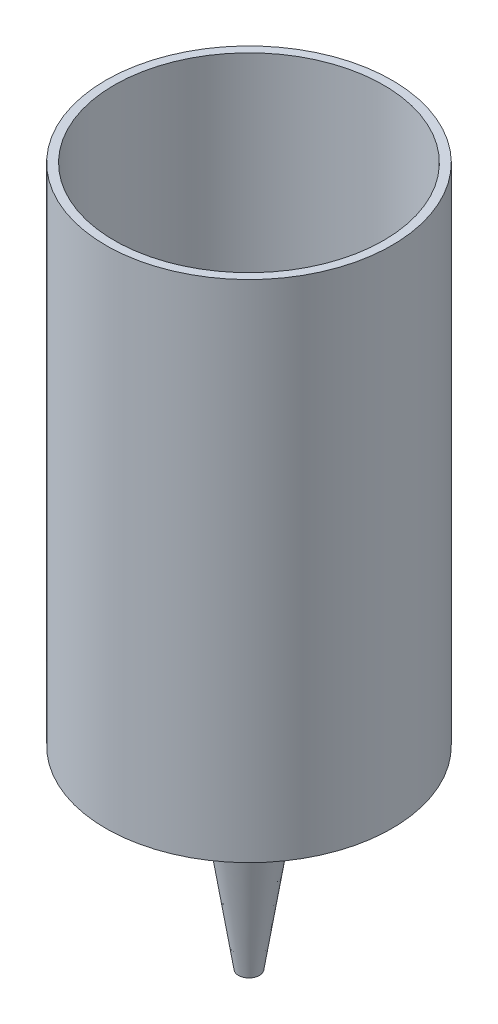
ISO-10303-21;
HEADER;
FILE_DESCRIPTION(('STEP AP214'),'2;1');
FILE_NAME('part.step','',(''),(''),'','','');
FILE_SCHEMA(('AUTOMOTIVE_DESIGN { 1 0 10303 214 1 1 1 1 }'));
ENDSEC;
DATA;
#1=APPLICATION_CONTEXT('core data for automotive mechanical design processes');
#2=APPLICATION_PROTOCOL_DEFINITION('international standard','automotive_design',2000,#1);
#3=PRODUCT_CONTEXT('',#1,'mechanical');
#4=PRODUCT('Part','Part','',(#3));
#5=PRODUCT_RELATED_PRODUCT_CATEGORY('part','',(#4));
#6=PRODUCT_DEFINITION_FORMATION('','',#4);
#7=PRODUCT_DEFINITION_CONTEXT('part definition',#1,'design');
#8=PRODUCT_DEFINITION('design','',#6,#7);
#9=PRODUCT_DEFINITION_SHAPE('','',#8);
#10=(LENGTH_UNIT() NAMED_UNIT(*) SI_UNIT(.MILLI.,.METRE.));
#11=(NAMED_UNIT(*) PLANE_ANGLE_UNIT() SI_UNIT($,.RADIAN.));
#12=(NAMED_UNIT(*) SI_UNIT($,.STERADIAN.) SOLID_ANGLE_UNIT());
#13=UNCERTAINTY_MEASURE_WITH_UNIT(LENGTH_MEASURE(1.E-05),#10,'distance_accuracy_value','');
#14=(GEOMETRIC_REPRESENTATION_CONTEXT(3) GLOBAL_UNCERTAINTY_ASSIGNED_CONTEXT((#13)) GLOBAL_UNIT_ASSIGNED_CONTEXT((#10,
#11,#12)) REPRESENTATION_CONTEXT('',''));
#15=CARTESIAN_POINT('',(0.,0.,0.));
#16=DIRECTION('',(0.,0.,1.));
#17=DIRECTION('',(1.,0.,0.));
#18=AXIS2_PLACEMENT_3D('',#15,#16,#17);
#19=CARTESIAN_POINT('',(0.,29.21,0.));
#20=DIRECTION('',(0.,1.,0.));
#21=DIRECTION('',(-1.,0.,0.));
#22=AXIS2_PLACEMENT_3D('',#19,#20,#21);
#23=CONICAL_SURFACE('',#22,21.59,1.33804250014829);
#24=CARTESIAN_POINT('',(0.,25.4,0.));
#25=DIRECTION('',(0.,1.,0.));
#26=DIRECTION('',(-1.,0.,0.));
#27=AXIS2_PLACEMENT_3D('',#24,#25,#26);
#28=CIRCLE('',#27,5.51744444444443);
#29=CARTESIAN_POINT('',(-5.51744444444445,25.4,0.));
#30=VERTEX_POINT('',#29);
#31=EDGE_CURVE('E59',#30,#30,#28,.T.);
#32=CARTESIAN_POINT('',(0.,29.21,0.));
#33=DIRECTION('',(0.,1.,0.));
#34=DIRECTION('',(-1.,0.,0.));
#35=AXIS2_PLACEMENT_3D('',#32,#33,#34);
#36=CIRCLE('',#35,21.59);
#37=CARTESIAN_POINT('',(-21.59,29.21,0.));
#38=VERTEX_POINT('',#37);
#39=EDGE_CURVE('E53',#38,#38,#36,.T.);
#40=CARTESIAN_POINT('',(-5.51744444444445,25.4,0.));
#41=CARTESIAN_POINT('',(-5.68486689814815,25.4396875,0.));
#42=CARTESIAN_POINT('',(-5.85228935185185,25.479375,0.));
#43=CARTESIAN_POINT('',(-6.18713425925926,25.55875,0.));
#44=CARTESIAN_POINT('',(-6.35455671296296,25.5984375,0.));
#45=CARTESIAN_POINT('',(-6.68940162037037,25.6778125,0.));
#46=CARTESIAN_POINT('',(-6.85682407407407,25.7175,0.));
#47=CARTESIAN_POINT('',(-7.19166898148148,25.796875,0.));
#48=CARTESIAN_POINT('',(-7.35909143518518,25.8365625,0.));
#49=CARTESIAN_POINT('',(-7.69393634259259,25.9159375,0.));
#50=CARTESIAN_POINT('',(-7.86135879629629,25.955625,0.));
#51=CARTESIAN_POINT('',(-8.1962037037037,26.035,0.));
#52=CARTESIAN_POINT('',(-8.3636261574074,26.0746875,0.));
#53=CARTESIAN_POINT('',(-8.69847106481481,26.1540625,0.));
#54=CARTESIAN_POINT('',(-8.86589351851852,26.19375,0.));
#55=CARTESIAN_POINT('',(-9.20073842592592,26.273125,0.));
#56=CARTESIAN_POINT('',(-9.36816087962963,26.3128125,0.));
#57=CARTESIAN_POINT('',(-9.70300578703703,26.3921875,0.));
#58=CARTESIAN_POINT('',(-9.87042824074074,26.431875,0.));
#59=CARTESIAN_POINT('',(-10.2052731481481,26.51125,0.));
#60=CARTESIAN_POINT('',(-10.3726956018518,26.5509375,0.));
#61=CARTESIAN_POINT('',(-10.7075405092593,26.6303125,0.));
#62=CARTESIAN_POINT('',(-10.874962962963,26.67,0.));
#63=CARTESIAN_POINT('',(-11.2098078703704,26.749375,0.));
#64=CARTESIAN_POINT('',(-11.3772303240741,26.7890625,0.));
#65=CARTESIAN_POINT('',(-11.7120752314815,26.8684375,0.));
#66=CARTESIAN_POINT('',(-11.8794976851852,26.908125,0.));
#67=CARTESIAN_POINT('',(-12.2143425925926,26.9875,0.));
#68=CARTESIAN_POINT('',(-12.3817650462963,27.0271875,0.));
#69=CARTESIAN_POINT('',(-12.7166099537037,27.1065625,0.));
#70=CARTESIAN_POINT('',(-12.8840324074074,27.14625,0.));
#71=CARTESIAN_POINT('',(-13.2188773148148,27.225625,0.));
#72=CARTESIAN_POINT('',(-13.3862997685185,27.2653125,0.));
#73=CARTESIAN_POINT('',(-13.7211446759259,27.3446875,0.));
#74=CARTESIAN_POINT('',(-13.8885671296296,27.384375,0.));
#75=CARTESIAN_POINT('',(-14.223412037037,27.46375,0.));
#76=CARTESIAN_POINT('',(-14.3908344907407,27.5034375,0.));
#77=CARTESIAN_POINT('',(-14.7256793981481,27.5828125,0.));
#78=CARTESIAN_POINT('',(-14.8931018518518,27.6225,0.));
#79=CARTESIAN_POINT('',(-15.2279467592592,27.701875,0.));
#80=CARTESIAN_POINT('',(-15.395369212963,27.7415625,0.));
#81=CARTESIAN_POINT('',(-15.7302141203704,27.8209375,0.));
#82=CARTESIAN_POINT('',(-15.8976365740741,27.860625,0.));
#83=CARTESIAN_POINT('',(-16.2324814814815,27.94,0.));
#84=CARTESIAN_POINT('',(-16.3999039351852,27.9796875,0.));
#85=CARTESIAN_POINT('',(-16.7347488425926,28.0590625,0.));
#86=CARTESIAN_POINT('',(-16.9021712962963,28.09875,0.));
#87=CARTESIAN_POINT('',(-17.2370162037037,28.178125,0.));
#88=CARTESIAN_POINT('',(-17.4044386574074,28.2178125,0.));
#89=CARTESIAN_POINT('',(-17.7392835648148,28.2971875,0.));
#90=CARTESIAN_POINT('',(-17.9067060185185,28.336875,0.));
#91=CARTESIAN_POINT('',(-18.2415509259259,28.41625,0.));
#92=CARTESIAN_POINT('',(-18.4089733796296,28.4559375,0.));
#93=CARTESIAN_POINT('',(-18.743818287037,28.5353125,0.));
#94=CARTESIAN_POINT('',(-18.9112407407407,28.575,0.));
#95=CARTESIAN_POINT('',(-19.2460856481481,28.654375,0.));
#96=CARTESIAN_POINT('',(-19.4135081018518,28.6940625,0.));
#97=CARTESIAN_POINT('',(-19.7483530092592,28.7734375,0.));
#98=CARTESIAN_POINT('',(-19.9157754629629,28.813125,0.));
#99=CARTESIAN_POINT('',(-20.2506203703704,28.8925,0.));
#100=CARTESIAN_POINT('',(-20.4180428240741,28.9321875,0.));
#101=CARTESIAN_POINT('',(-20.7528877314815,29.0115625,0.));
#102=CARTESIAN_POINT('',(-20.9203101851852,29.05125,0.));
#103=CARTESIAN_POINT('',(-21.2551550925926,29.130625,0.));
#104=CARTESIAN_POINT('',(-21.4225775462963,29.1703125,0.));
#105=CARTESIAN_POINT('',(-21.59,29.21,0.));
#106=B_SPLINE_CURVE_WITH_KNOTS('',3,(#40,#41,#42,#43,#44,#45,#46,#47,#48,#49,#50,#51,#52,#53,
#54,#55,#56,#57,#58,#59,#60,#61,#62,#63,#64,#65,#66,#67,#68,#69,#70,#71,#72,#73,#74,#75,#76,#77,
#78,#79,#80,#81,#82,#83,#84,#85,#86,#87,#88,#89,#90,#91,#92,#93,#94,#95,#96,#97,#98,#99,#100,
#101,#102,#103,#104,#105),.UNSPECIFIED.,.F.,.F.,(4,2,2,2,2,2,2,2,2,2,2,2,2,2,2,2,2,2,2,2,2,2,2,
2,2,2,2,2,2,2,2,2,4),(0.,0.516186381982099,1.0323727639642,1.54855914594629,2.06474552792839,
2.58093190991049,3.09711829189259,3.61330467387468,4.12949105585678,4.64567743783888,
5.16186381982098,5.67805020180308,6.19423658378518,6.71042296576727,7.22660934774937,
7.74279572973147,8.25898211171357,8.77516849369567,9.29135487567777,9.80754125765987,
10.323727639642,10.8399140216241,11.3561004036062,11.8722867855883,12.3884731675704,
12.9046595495525,13.4208459315346,13.9370323135167,14.4532186954988,14.9694050774809,
15.485591459463,16.001777841445,16.5179642234271),.UNSPECIFIED.);
#107=EDGE_CURVE('BSEAM39',#30,#38,#106,.T.);
#108=ORIENTED_EDGE('',*,*,#31,.T.);
#109=ORIENTED_EDGE('',*,*,#39,.F.);
#110=ORIENTED_EDGE('',*,*,#107,.T.);
#111=ORIENTED_EDGE('',*,*,#107,.F.);
#112=EDGE_LOOP('',(#108,#110,#109,#111));
#113=FACE_BOUND('',#112,.T.);
#114=ADVANCED_FACE('F39',(#113),#23,.T.);
#115=CARTESIAN_POINT('',(0.,105.41,0.));
#116=DIRECTION('',(0.,1.,0.));
#117=DIRECTION('',(-1.,0.,0.));
#118=AXIS2_PLACEMENT_3D('',#115,#116,#117);
#119=CYLINDRICAL_SURFACE('',#118,21.59);
#120=ORIENTED_EDGE('',*,*,#39,.T.);
#121=EDGE_LOOP('',(#120));
#122=FACE_BOUND('',#121,.T.);
#123=CARTESIAN_POINT('',(0.,105.41,0.));
#124=DIRECTION('',(0.,1.,0.));
#125=DIRECTION('',(-1.,0.,0.));
#126=AXIS2_PLACEMENT_3D('',#123,#124,#125);
#127=CIRCLE('',#126,21.59);
#128=CARTESIAN_POINT('',(-21.59,105.41,0.));
#129=VERTEX_POINT('',#128);
#130=EDGE_CURVE('E48',#129,#129,#127,.T.);
#131=ORIENTED_EDGE('',*,*,#130,.F.);
#132=EDGE_LOOP('',(#131));
#133=FACE_BOUND('',#132,.T.);
#134=ADVANCED_FACE('F97',(#122,#133),#119,.T.);
#135=CARTESIAN_POINT('',(0.,25.4,0.));
#136=DIRECTION('',(0.,1.,0.));
#137=DIRECTION('',(-1.,0.,0.));
#138=AXIS2_PLACEMENT_3D('',#135,#136,#137);
#139=CONICAL_SURFACE('',#138,5.51744444444443,0.153505027981878);
#140=CARTESIAN_POINT('',(0.,0.,0.));
#141=DIRECTION('',(0.,1.,0.));
#142=DIRECTION('',(-1.,0.,0.));
#143=AXIS2_PLACEMENT_3D('',#140,#141,#142);
#144=CIRCLE('',#143,1.5875);
#145=CARTESIAN_POINT('',(-1.5875,0.,0.));
#146=VERTEX_POINT('',#145);
#147=EDGE_CURVE('E10',#146,#146,#144,.T.);
#148=CARTESIAN_POINT('',(-1.5875,0.,0.));
#149=CARTESIAN_POINT('',(-1.62843692129629,0.264583333333333,0.));
#150=CARTESIAN_POINT('',(-1.66937384259259,0.529166666666666,0.));
#151=CARTESIAN_POINT('',(-1.75124768518518,1.05833333333333,0.));
#152=CARTESIAN_POINT('',(-1.79218460648148,1.32291666666667,0.));
#153=CARTESIAN_POINT('',(-1.87405844907407,1.85208333333334,0.));
#154=CARTESIAN_POINT('',(-1.91499537037037,2.11666666666667,0.));
#155=CARTESIAN_POINT('',(-1.99686921296296,2.64583333333333,0.));
#156=CARTESIAN_POINT('',(-2.03780613425926,2.91041666666667,0.));
#157=CARTESIAN_POINT('',(-2.11967997685185,3.43958333333333,0.));
#158=CARTESIAN_POINT('',(-2.16061689814814,3.70416666666667,0.));
#159=CARTESIAN_POINT('',(-2.24249074074074,4.23333333333333,0.));
#160=CARTESIAN_POINT('',(-2.28342766203703,4.49791666666667,0.));
#161=CARTESIAN_POINT('',(-2.36530150462963,5.02708333333334,0.));
#162=CARTESIAN_POINT('',(-2.40623842592592,5.29166666666667,0.));
#163=CARTESIAN_POINT('',(-2.48811226851852,5.82083333333333,0.));
#164=CARTESIAN_POINT('',(-2.52904918981481,6.08541666666667,0.));
#165=CARTESIAN_POINT('',(-2.6109230324074,6.61458333333334,0.));
#166=CARTESIAN_POINT('',(-2.6518599537037,6.87916666666667,0.));
#167=CARTESIAN_POINT('',(-2.73373379629629,7.40833333333334,0.));
#168=CARTESIAN_POINT('',(-2.77467071759259,7.67291666666667,0.));
#169=CARTESIAN_POINT('',(-2.85654456018518,8.20208333333334,0.));
#170=CARTESIAN_POINT('',(-2.89748148148148,8.46666666666667,0.));
#171=CARTESIAN_POINT('',(-2.97935532407407,8.99583333333334,0.));
#172=CARTESIAN_POINT('',(-3.02029224537036,9.26041666666667,0.));
#173=CARTESIAN_POINT('',(-3.10216608796296,9.78958333333334,0.));
#174=CARTESIAN_POINT('',(-3.14310300925925,10.0541666666667,0.));
#175=CARTESIAN_POINT('',(-3.22497685185185,10.5833333333333,0.));
#176=CARTESIAN_POINT('',(-3.26591377314814,10.8479166666667,0.));
#177=CARTESIAN_POINT('',(-3.34778761574073,11.3770833333333,0.));
#178=CARTESIAN_POINT('',(-3.38872453703703,11.6416666666667,0.));
#179=CARTESIAN_POINT('',(-3.47059837962962,12.1708333333333,0.));
#180=CARTESIAN_POINT('',(-3.51153530092592,12.4354166666667,0.));
#181=CARTESIAN_POINT('',(-3.59340914351851,12.9645833333333,0.));
#182=CARTESIAN_POINT('',(-3.63434606481481,13.2291666666667,0.));
#183=CARTESIAN_POINT('',(-3.7162199074074,13.7583333333333,0.));
#184=CARTESIAN_POINT('',(-3.7571568287037,14.0229166666667,0.));
#185=CARTESIAN_POINT('',(-3.83903067129629,14.5520833333333,0.));
#186=CARTESIAN_POINT('',(-3.87996759259258,14.8166666666667,0.));
#187=CARTESIAN_POINT('',(-3.96184143518518,15.3458333333333,0.));
#188=CARTESIAN_POINT('',(-4.00277835648147,15.6104166666667,0.));
#189=CARTESIAN_POINT('',(-4.08465219907407,16.1395833333333,0.));
#190=CARTESIAN_POINT('',(-4.12558912037036,16.4041666666667,0.));
#191=CARTESIAN_POINT('',(-4.20746296296295,16.9333333333333,0.));
#192=CARTESIAN_POINT('',(-4.24839988425925,17.1979166666667,0.));
#193=CARTESIAN_POINT('',(-4.33027372685184,17.7270833333333,0.));
#194=CARTESIAN_POINT('',(-4.37121064814814,17.9916666666667,0.));
#195=CARTESIAN_POINT('',(-4.45308449074073,18.5208333333333,0.));
#196=CARTESIAN_POINT('',(-4.49402141203703,18.7854166666667,0.));
#197=CARTESIAN_POINT('',(-4.57589525462962,19.3145833333333,0.));
#198=CARTESIAN_POINT('',(-4.61683217592592,19.5791666666667,0.));
#199=CARTESIAN_POINT('',(-4.69870601851851,20.1083333333333,0.));
#200=CARTESIAN_POINT('',(-4.73964293981481,20.3729166666667,0.));
#201=CARTESIAN_POINT('',(-4.8215167824074,20.9020833333333,0.));
#202=CARTESIAN_POINT('',(-4.86245370370369,21.1666666666667,0.));
#203=CARTESIAN_POINT('',(-4.94432754629629,21.6958333333333,0.));
#204=CARTESIAN_POINT('',(-4.98526446759258,21.9604166666667,0.));
#205=CARTESIAN_POINT('',(-5.06713831018517,22.4895833333333,0.));
#206=CARTESIAN_POINT('',(-5.10807523148147,22.7541666666667,0.));
#207=CARTESIAN_POINT('',(-5.18994907407406,23.2833333333333,0.));
#208=CARTESIAN_POINT('',(-5.23088599537036,23.5479166666667,0.));
#209=CARTESIAN_POINT('',(-5.31275983796295,24.0770833333333,0.));
#210=CARTESIAN_POINT('',(-5.35369675925925,24.3416666666667,0.));
#211=CARTESIAN_POINT('',(-5.43557060185184,24.8708333333333,0.));
#212=CARTESIAN_POINT('',(-5.47650752314814,25.1354166666667,0.));
#213=CARTESIAN_POINT('',(-5.51744444444443,25.4,0.));
#214=B_SPLINE_CURVE_WITH_KNOTS('',3,(#148,#149,#150,#151,#152,#153,#154,#155,#156,#157,#158,
#159,#160,#161,#162,#163,#164,#165,#166,#167,#168,#169,#170,#171,#172,#173,#174,#175,#176,#177,
#178,#179,#180,#181,#182,#183,#184,#185,#186,#187,#188,#189,#190,#191,#192,#193,#194,#195,#196,
#197,#198,#199,#200,#201,#202,#203,#204,#205,#206,#207,#208,#209,#210,#211,#212,#213),
.UNSPECIFIED.,.F.,.F.,(4,2,2,2,2,2,2,2,2,2,2,2,2,2,2,2,2,2,2,2,2,2,2,2,2,2,2,2,2,2,2,2,4),(0.,
0.803194588021465,1.60638917604293,2.4095837640644,3.21277835208586,4.01597294010733,
4.8191675281288,5.62236211615026,6.42555670417173,7.2287512921932,8.03194588021466,
8.83514046823613,9.6383350562576,10.4415296442791,11.2447242323005,12.047918820322,
12.8511134083435,13.6543079963649,14.4575025843864,15.2606971724079,16.0638917604293,
16.8670863484508,17.6702809364723,18.4734755244937,19.2766701125152,20.0798647005367,
20.8830592885581,21.6862538765796,22.4894484646011,23.2926430526225,24.095837640644,
24.8990322286654,25.7022268166869),.UNSPECIFIED.);
#215=EDGE_CURVE('BSEAM41',#146,#30,#214,.T.);
#216=ORIENTED_EDGE('',*,*,#147,.T.);
#217=ORIENTED_EDGE('',*,*,#31,.F.);
#218=ORIENTED_EDGE('',*,*,#215,.T.);
#219=ORIENTED_EDGE('',*,*,#215,.F.);
#220=EDGE_LOOP('',(#216,#218,#217,#219));
#221=FACE_BOUND('',#220,.T.);
#222=ADVANCED_FACE('F41',(#221),#139,.T.);
#223=CARTESIAN_POINT('',(0.,105.41,0.));
#224=DIRECTION('',(0.,-1.,0.));
#225=DIRECTION('',(1.,0.,0.));
#226=AXIS2_PLACEMENT_3D('',#223,#224,#225);
#227=PLANE('',#226);
#228=CARTESIAN_POINT('',(0.,105.41,0.));
#229=DIRECTION('',(0.,-1.,0.));
#230=DIRECTION('',(1.,0.,0.));
#231=AXIS2_PLACEMENT_3D('',#228,#229,#230);
#232=CIRCLE('',#231,20.32);
#233=CARTESIAN_POINT('',(20.32,105.41,0.));
#234=VERTEX_POINT('',#233);
#235=EDGE_CURVE('E63',#234,#234,#232,.F.);
#236=ORIENTED_EDGE('',*,*,#235,.F.);
#237=EDGE_LOOP('',(#236));
#238=FACE_BOUND('',#237,.T.);
#239=ORIENTED_EDGE('',*,*,#130,.T.);
#240=EDGE_LOOP('',(#239));
#241=FACE_BOUND('',#240,.T.);
#242=ADVANCED_FACE('F105',(#238,#241),#227,.F.);
#243=CARTESIAN_POINT('',(0.,0.,0.));
#244=DIRECTION('',(0.,-1.,0.));
#245=DIRECTION('',(1.,0.,0.));
#246=AXIS2_PLACEMENT_3D('',#243,#244,#245);
#247=PLANE('',#246);
#248=CARTESIAN_POINT('',(0.,0.,0.));
#249=DIRECTION('',(0.,-1.,0.));
#250=DIRECTION('',(1.,0.,0.));
#251=AXIS2_PLACEMENT_3D('',#248,#249,#250);
#252=CIRCLE('',#251,1.0795);
#253=CARTESIAN_POINT('',(1.0795,0.,0.));
#254=VERTEX_POINT('',#253);
#255=EDGE_CURVE('E75',#254,#254,#252,.T.);
#256=ORIENTED_EDGE('',*,*,#255,.F.);
#257=EDGE_LOOP('',(#256));
#258=FACE_BOUND('',#257,.T.);
#259=ORIENTED_EDGE('',*,*,#147,.F.);
#260=EDGE_LOOP('',(#259));
#261=FACE_BOUND('',#260,.T.);
#262=ADVANCED_FACE('F111',(#258,#261),#247,.T.);
#263=CARTESIAN_POINT('',(0.,30.4457543144818,0.));
#264=DIRECTION('',(0.,1.,0.));
#265=DIRECTION('',(-1.,0.,0.));
#266=AXIS2_PLACEMENT_3D('',#263,#264,#265);
#267=CONICAL_SURFACE('',#266,21.2970643855048,1.33804250014829);
#268=CARTESIAN_POINT('',(0.,26.4386536198894,0.));
#269=DIRECTION('',(0.,1.,0.));
#270=DIRECTION('',(-1.,0.,0.));
#271=AXIS2_PLACEMENT_3D('',#268,#269,#270);
#272=CIRCLE('',#271,4.39303589979853);
#273=CARTESIAN_POINT('',(-4.39303589979853,26.4386536198894,0.));
#274=VERTEX_POINT('',#273);
#275=EDGE_CURVE('E71',#274,#274,#272,.T.);
#276=CARTESIAN_POINT('',(0.,30.2141411590065,0.));
#277=DIRECTION('',(0.,1.,0.));
#278=DIRECTION('',(-1.,0.,0.));
#279=AXIS2_PLACEMENT_3D('',#276,#277,#278);
#280=CIRCLE('',#279,20.32);
#281=CARTESIAN_POINT('',(-20.32,30.2141411590065,0.));
#282=VERTEX_POINT('',#281);
#283=EDGE_CURVE('E67',#282,#282,#280,.T.);
#284=CARTESIAN_POINT('',(-4.39303589979853,26.4386536198894,0.));
#285=CARTESIAN_POINT('',(-4.55894177584229,26.4779816150886,0.));
#286=CARTESIAN_POINT('',(-4.72484765188606,26.5173096102877,0.));
#287=CARTESIAN_POINT('',(-5.05665940397359,26.595965600686,0.));
#288=CARTESIAN_POINT('',(-5.22256528001735,26.6352935958851,0.));
#289=CARTESIAN_POINT('',(-5.55437703210488,26.7139495862834,0.));
#290=CARTESIAN_POINT('',(-5.72028290814865,26.7532775814825,0.));
#291=CARTESIAN_POINT('',(-6.05209466023618,26.8319335718808,0.));
#292=CARTESIAN_POINT('',(-6.21800053627994,26.8712615670799,0.));
#293=CARTESIAN_POINT('',(-6.54981228836747,26.9499175574782,0.));
#294=CARTESIAN_POINT('',(-6.71571816441124,26.9892455526773,0.));
#295=CARTESIAN_POINT('',(-7.04752991649877,27.0679015430756,0.));
#296=CARTESIAN_POINT('',(-7.21343579254254,27.1072295382747,0.));
#297=CARTESIAN_POINT('',(-7.54524754463007,27.185885528673,0.));
#298=CARTESIAN_POINT('',(-7.71115342067383,27.2252135238722,0.));
#299=CARTESIAN_POINT('',(-8.04296517276136,27.3038695142704,0.));
#300=CARTESIAN_POINT('',(-8.20887104880513,27.3431975094696,0.));
#301=CARTESIAN_POINT('',(-8.54068280089266,27.4218534998678,0.));
#302=CARTESIAN_POINT('',(-8.70658867693642,27.461181495067,0.));
#303=CARTESIAN_POINT('',(-9.03840042902395,27.5398374854652,0.));
#304=CARTESIAN_POINT('',(-9.20430630506772,27.5791654806644,0.));
#305=CARTESIAN_POINT('',(-9.53611805715525,27.6578214710627,0.));
#306=CARTESIAN_POINT('',(-9.70202393319901,27.6971494662618,0.));
#307=CARTESIAN_POINT('',(-10.0338356852865,27.7758054566601,0.));
#308=CARTESIAN_POINT('',(-10.1997415613303,27.8151334518592,0.));
#309=CARTESIAN_POINT('',(-10.5315533134178,27.8937894422575,0.));
#310=CARTESIAN_POINT('',(-10.6974591894616,27.9331174374566,0.));
#311=CARTESIAN_POINT('',(-11.0292709415491,28.0117734278549,0.));
#312=CARTESIAN_POINT('',(-11.1951768175929,28.051101423054,0.));
#313=CARTESIAN_POINT('',(-11.5269885696804,28.1297574134523,0.));
#314=CARTESIAN_POINT('',(-11.6928944457242,28.1690854086514,0.));
#315=CARTESIAN_POINT('',(-12.0247061978117,28.2477413990497,0.));
#316=CARTESIAN_POINT('',(-12.1906120738555,28.2870693942488,0.));
#317=CARTESIAN_POINT('',(-12.522423825943,28.3657253846471,0.));
#318=CARTESIAN_POINT('',(-12.6883297019868,28.4050533798463,0.));
#319=CARTESIAN_POINT('',(-13.0201414540743,28.4837093702445,0.));
#320=CARTESIAN_POINT('',(-13.1860473301181,28.5230373654437,0.));
#321=CARTESIAN_POINT('',(-13.5178590822056,28.6016933558419,0.));
#322=CARTESIAN_POINT('',(-13.6837649582494,28.6410213510411,0.));
#323=CARTESIAN_POINT('',(-14.0155767103369,28.7196773414393,0.));
#324=CARTESIAN_POINT('',(-14.1814825863807,28.7590053366385,0.));
#325=CARTESIAN_POINT('',(-14.5132943384682,28.8376613270368,0.));
#326=CARTESIAN_POINT('',(-14.679200214512,28.8769893222359,0.));
#327=CARTESIAN_POINT('',(-15.0110119665995,28.9556453126342,0.));
#328=CARTESIAN_POINT('',(-15.1769178426433,28.9949733078333,0.));
#329=CARTESIAN_POINT('',(-15.5087295947308,29.0736292982316,0.));
#330=CARTESIAN_POINT('',(-15.6746354707746,29.1129572934307,0.));
#331=CARTESIAN_POINT('',(-16.0064472228621,29.191613283829,0.));
#332=CARTESIAN_POINT('',(-16.1723530989059,29.2309412790281,0.));
#333=CARTESIAN_POINT('',(-16.5041648509934,29.3095972694264,0.));
#334=CARTESIAN_POINT('',(-16.6700707270371,29.3489252646255,0.));
#335=CARTESIAN_POINT('',(-17.0018824791247,29.4275812550238,0.));
#336=CARTESIAN_POINT('',(-17.1677883551684,29.4669092502229,0.));
#337=CARTESIAN_POINT('',(-17.499600107256,29.5455652406212,0.));
#338=CARTESIAN_POINT('',(-17.6655059832997,29.5848932358204,0.));
#339=CARTESIAN_POINT('',(-17.9973177353873,29.6635492262186,0.));
#340=CARTESIAN_POINT('',(-18.163223611431,29.7028772214178,0.));
#341=CARTESIAN_POINT('',(-18.4950353635186,29.781533211816,0.));
#342=CARTESIAN_POINT('',(-18.6609412395623,29.8208612070152,0.));
#343=CARTESIAN_POINT('',(-18.9927529916499,29.8995171974134,0.));
#344=CARTESIAN_POINT('',(-19.1586588676936,29.9388451926126,0.));
#345=CARTESIAN_POINT('',(-19.4904706197812,30.0175011830109,0.));
#346=CARTESIAN_POINT('',(-19.6563764958249,30.05682917821,0.));
#347=CARTESIAN_POINT('',(-19.9881882479125,30.1354851686083,0.));
#348=CARTESIAN_POINT('',(-20.1540941239562,30.1748131638074,0.));
#349=CARTESIAN_POINT('',(-20.32,30.2141411590065,0.));
#350=B_SPLINE_CURVE_WITH_KNOTS('',3,(#284,#285,#286,#287,#288,#289,#290,#291,#292,#293,#294,
#295,#296,#297,#298,#299,#300,#301,#302,#303,#304,#305,#306,#307,#308,#309,#310,#311,#312,#313,
#314,#315,#316,#317,#318,#319,#320,#321,#322,#323,#324,#325,#326,#327,#328,#329,#330,#331,#332,
#333,#334,#335,#336,#337,#338,#339,#340,#341,#342,#343,#344,#345,#346,#347,#348,#349),
.UNSPECIFIED.,.F.,.F.,(4,2,2,2,2,2,2,2,2,2,2,2,2,2,2,2,2,2,2,2,2,2,2,2,2,2,2,2,2,2,2,2,4),(0.,
0.511510565101145,1.02302113020229,1.53453169530343,2.04604226040458,2.55755282550572,
3.06906339060687,3.58057395570801,4.09208452080916,4.6035950859103,5.11510565101144,
5.62661621611259,6.13812678121373,6.64963734631488,7.16114791141602,7.67265847651717,
8.18416904161831,8.69567960671946,9.2071901718206,9.71870073692175,10.2302113020229,
10.741721867124,11.2532324322252,11.7647429973263,12.2762535624275,12.7877641275286,
13.2992746926298,13.8107852577309,14.3222958228321,14.8338063879332,15.3453169530343,
15.8568275181355,16.3683380832366),.UNSPECIFIED.);
#351=EDGE_CURVE('BSEAM95',#274,#282,#350,.T.);
#352=ORIENTED_EDGE('',*,*,#275,.F.);
#353=ORIENTED_EDGE('',*,*,#283,.T.);
#354=ORIENTED_EDGE('',*,*,#351,.T.);
#355=ORIENTED_EDGE('',*,*,#351,.F.);
#356=EDGE_LOOP('',(#352,#354,#353,#355));
#357=FACE_BOUND('',#356,.T.);
#358=ADVANCED_FACE('F95',(#357),#267,.F.);
#359=CARTESIAN_POINT('',(0.,105.41,0.));
#360=DIRECTION('',(0.,1.,0.));
#361=DIRECTION('',(-1.,0.,0.));
#362=AXIS2_PLACEMENT_3D('',#359,#360,#361);
#363=CYLINDRICAL_SURFACE('',#362,20.32);
#364=ORIENTED_EDGE('',*,*,#283,.F.);
#365=EDGE_LOOP('',(#364));
#366=FACE_BOUND('',#365,.T.);
#367=ORIENTED_EDGE('',*,*,#235,.T.);
#368=EDGE_LOOP('',(#367));
#369=FACE_BOUND('',#368,.T.);
#370=ADVANCED_FACE('F93',(#366,#369),#363,.F.);
#371=CARTESIAN_POINT('',(0.,25.5941866547222,0.));
#372=DIRECTION('',(0.,1.,0.));
#373=DIRECTION('',(-1.,0.,0.));
#374=AXIS2_PLACEMENT_3D('',#371,#372,#373);
#375=CONICAL_SURFACE('',#374,4.26237809435461,0.153505027981878);
#376=CARTESIAN_POINT('',(0.,5.02262266966545,0.));
#377=DIRECTION('',(0.,1.,0.));
#378=DIRECTION('',(-1.,0.,0.));
#379=AXIS2_PLACEMENT_3D('',#376,#377,#378);
#380=CIRCLE('',#379,1.0795);
#381=CARTESIAN_POINT('',(-1.0795,5.02262266966545,0.));
#382=VERTEX_POINT('',#381);
#383=EDGE_CURVE('E43',#382,#382,#380,.F.);
#384=CARTESIAN_POINT('',(-1.0795,5.02262266966545,0.));
#385=CARTESIAN_POINT('',(-1.11401599895623,5.24570632539695,0.));
#386=CARTESIAN_POINT('',(-1.14853199791247,5.46878998112845,0.));
#387=CARTESIAN_POINT('',(-1.21756399582494,5.91495729259145,0.));
#388=CARTESIAN_POINT('',(-1.25207999478117,6.13804094832295,0.));
#389=CARTESIAN_POINT('',(-1.32111199269364,6.58420825978595,0.));
#390=CARTESIAN_POINT('',(-1.35562799164988,6.80729191551745,0.));
#391=CARTESIAN_POINT('',(-1.42465998956235,7.25345922698045,0.));
#392=CARTESIAN_POINT('',(-1.45917598851858,7.47654288271195,0.));
#393=CARTESIAN_POINT('',(-1.52820798643105,7.92271019417495,0.));
#394=CARTESIAN_POINT('',(-1.56272398538729,8.14579384990645,0.));
#395=CARTESIAN_POINT('',(-1.63175598329976,8.59196116136944,0.));
#396=CARTESIAN_POINT('',(-1.66627198225599,8.81504481710094,0.));
#397=CARTESIAN_POINT('',(-1.73530398016846,9.26121212856394,0.));
#398=CARTESIAN_POINT('',(-1.76981997912469,9.48429578429544,0.));
#399=CARTESIAN_POINT('',(-1.83885197703716,9.93046309575844,0.));
#400=CARTESIAN_POINT('',(-1.8733679759934,10.1535467514899,0.));
#401=CARTESIAN_POINT('',(-1.94239997390587,10.5997140629529,0.));
#402=CARTESIAN_POINT('',(-1.9769159728621,10.8227977186844,0.));
#403=CARTESIAN_POINT('',(-2.04594797077457,11.2689650301474,0.));
#404=CARTESIAN_POINT('',(-2.08046396973081,11.4920486858789,0.));
#405=CARTESIAN_POINT('',(-2.14949596764328,11.9382159973419,0.));
#406=CARTESIAN_POINT('',(-2.18401196659951,12.1612996530734,0.));
#407=CARTESIAN_POINT('',(-2.25304396451198,12.6074669645364,0.));
#408=CARTESIAN_POINT('',(-2.28755996346821,12.8305506202679,0.));
#409=CARTESIAN_POINT('',(-2.35659196138068,13.2767179317309,0.));
#410=CARTESIAN_POINT('',(-2.39110796033692,13.4998015874624,0.));
#411=CARTESIAN_POINT('',(-2.46013995824939,13.9459688989254,0.));
#412=CARTESIAN_POINT('',(-2.49465595720562,14.1690525546569,0.));
#413=CARTESIAN_POINT('',(-2.56368795511809,14.6152198661199,0.));
#414=CARTESIAN_POINT('',(-2.59820395407433,14.8383035218514,0.));
#415=CARTESIAN_POINT('',(-2.6672359519868,15.2844708333144,0.));
#416=CARTESIAN_POINT('',(-2.70175195094303,15.5075544890459,0.));
#417=CARTESIAN_POINT('',(-2.7707839488555,15.9537218005089,0.));
#418=CARTESIAN_POINT('',(-2.80529994781174,16.1768054562404,0.));
#419=CARTESIAN_POINT('',(-2.8743319457242,16.6229727677034,0.));
#420=CARTESIAN_POINT('',(-2.90884794468044,16.8460564234349,0.));
#421=CARTESIAN_POINT('',(-2.97787994259291,17.2922237348979,0.));
#422=CARTESIAN_POINT('',(-3.01239594154914,17.5153073906294,0.));
#423=CARTESIAN_POINT('',(-3.08142793946161,17.9614747020924,0.));
#424=CARTESIAN_POINT('',(-3.11594393841785,18.1845583578239,0.));
#425=CARTESIAN_POINT('',(-3.18497593633032,18.6307256692869,0.));
#426=CARTESIAN_POINT('',(-3.21949193528655,18.8538093250184,0.));
#427=CARTESIAN_POINT('',(-3.28852393319902,19.2999766364814,0.));
#428=CARTESIAN_POINT('',(-3.32303993215526,19.5230602922129,0.));
#429=CARTESIAN_POINT('',(-3.39207193006773,19.9692276036759,0.));
#430=CARTESIAN_POINT('',(-3.42658792902396,20.1923112594074,0.));
#431=CARTESIAN_POINT('',(-3.49561992693643,20.6384785708704,0.));
#432=CARTESIAN_POINT('',(-3.53013592589266,20.8615622266019,0.));
#433=CARTESIAN_POINT('',(-3.59916792380513,21.3077295380649,0.));
#434=CARTESIAN_POINT('',(-3.63368392276137,21.5308131937964,0.));
#435=CARTESIAN_POINT('',(-3.70271592067384,21.9769805052594,0.));
#436=CARTESIAN_POINT('',(-3.73723191963007,22.2000641609909,0.));
#437=CARTESIAN_POINT('',(-3.80626391754254,22.6462314724539,0.));
#438=CARTESIAN_POINT('',(-3.84077991649878,22.8693151281854,0.));
#439=CARTESIAN_POINT('',(-3.90981191441125,23.3154824396484,0.));
#440=CARTESIAN_POINT('',(-3.94432791336748,23.5385660953799,0.));
#441=CARTESIAN_POINT('',(-4.01335991127995,23.9847334068429,0.));
#442=CARTESIAN_POINT('',(-4.04787591023618,24.2078170625744,0.));
#443=CARTESIAN_POINT('',(-4.11690790814865,24.6539843740374,0.));
#444=CARTESIAN_POINT('',(-4.15142390710489,24.8770680297689,0.));
#445=CARTESIAN_POINT('',(-4.22045590501736,25.3232353412319,0.));
#446=CARTESIAN_POINT('',(-4.25497190397359,25.5463189969634,0.));
#447=CARTESIAN_POINT('',(-4.32400390188606,25.9924863084264,0.));
#448=CARTESIAN_POINT('',(-4.3585199008423,26.2155699641579,0.));
#449=CARTESIAN_POINT('',(-4.39303589979853,26.4386536198894,0.));
#450=B_SPLINE_CURVE_WITH_KNOTS('',3,(#384,#385,#386,#387,#388,#389,#390,#391,#392,#393,#394,
#395,#396,#397,#398,#399,#400,#401,#402,#403,#404,#405,#406,#407,#408,#409,#410,#411,#412,#413,
#414,#415,#416,#417,#418,#419,#420,#421,#422,#423,#424,#425,#426,#427,#428,#429,#430,#431,#432,
#433,#434,#435,#436,#437,#438,#439,#440,#441,#442,#443,#444,#445,#446,#447,#448,#449),
.UNSPECIFIED.,.F.,.F.,(4,2,2,2,2,2,2,2,2,2,2,2,2,2,2,2,2,2,2,2,2,2,2,2,2,2,2,2,2,2,2,2,4),(0.,
0.677214179374806,1.35442835874962,2.03164253812442,2.70885671749923,3.38607089687404,
4.06328507624884,4.74049925562365,5.41771343499846,6.09492761437327,6.77214179374807,
7.44935597312288,8.12657015249769,8.8037843318725,9.4809985112473,10.1582126906221,
10.8354268699969,11.5126410493717,12.1898552287465,12.8670694081213,13.5442835874961,
14.221497766871,14.8987119462458,15.5759261256206,16.2531403049954,16.9303544843702,
17.607568663745,18.2847828431198,18.9619970224946,19.6392112018694,20.3164253812442,
20.993639560619,21.6708537399938),.UNSPECIFIED.);
#451=EDGE_CURVE('BSEAM84',#382,#274,#450,.T.);
#452=ORIENTED_EDGE('',*,*,#383,.T.);
#453=ORIENTED_EDGE('',*,*,#275,.T.);
#454=ORIENTED_EDGE('',*,*,#451,.T.);
#455=ORIENTED_EDGE('',*,*,#451,.F.);
#456=EDGE_LOOP('',(#452,#454,#453,#455));
#457=FACE_BOUND('',#456,.T.);
#458=ADVANCED_FACE('F84',(#457),#375,.F.);
#459=CARTESIAN_POINT('',(0.,105.41,0.));
#460=DIRECTION('',(0.,-1.,0.));
#461=DIRECTION('',(1.,0.,0.));
#462=AXIS2_PLACEMENT_3D('',#459,#460,#461);
#463=CYLINDRICAL_SURFACE('',#462,1.0795);
#464=ORIENTED_EDGE('',*,*,#255,.T.);
#465=EDGE_LOOP('',(#464));
#466=FACE_BOUND('',#465,.T.);
#467=ORIENTED_EDGE('',*,*,#383,.F.);
#468=EDGE_LOOP('',(#467));
#469=FACE_BOUND('',#468,.T.);
#470=ADVANCED_FACE('F87',(#466,#469),#463,.F.);
#471=CLOSED_SHELL('',(#114,#134,#222,#242,#262,#358,#370,#458,#470));
#472=MANIFOLD_SOLID_BREP('B2',#471);
#473=ADVANCED_BREP_SHAPE_REPRESENTATION('',(#18,#472),#14);
#474=SHAPE_DEFINITION_REPRESENTATION(#9,#473);
ENDSEC;
END-ISO-10303-21;
